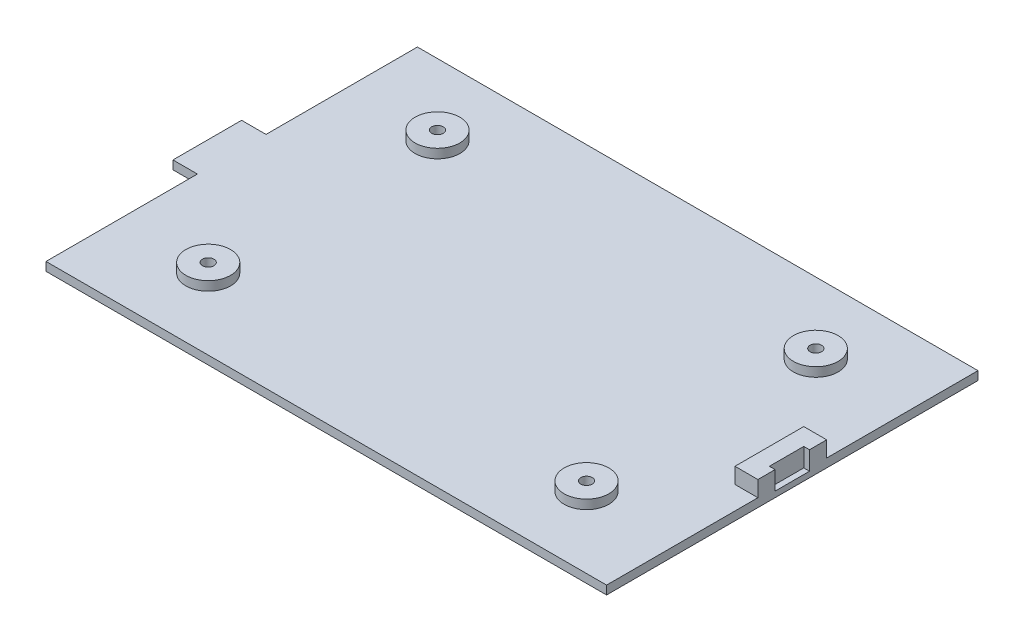
ISO-10303-21;
HEADER;
FILE_DESCRIPTION(('STEP AP214'),'2;1');
FILE_NAME('part.step','',(''),(''),'','','');
FILE_SCHEMA(('AUTOMOTIVE_DESIGN { 1 0 10303 214 1 1 1 1 }'));
ENDSEC;
DATA;
#1=APPLICATION_CONTEXT('core data for automotive mechanical design processes');
#2=APPLICATION_PROTOCOL_DEFINITION('international standard','automotive_design',2000,#1);
#3=PRODUCT_CONTEXT('',#1,'mechanical');
#4=PRODUCT('Part','Part','',(#3));
#5=PRODUCT_RELATED_PRODUCT_CATEGORY('part','',(#4));
#6=PRODUCT_DEFINITION_FORMATION('','',#4);
#7=PRODUCT_DEFINITION_CONTEXT('part definition',#1,'design');
#8=PRODUCT_DEFINITION('design','',#6,#7);
#9=PRODUCT_DEFINITION_SHAPE('','',#8);
#10=(LENGTH_UNIT() NAMED_UNIT(*) SI_UNIT(.MILLI.,.METRE.));
#11=(NAMED_UNIT(*) PLANE_ANGLE_UNIT() SI_UNIT($,.RADIAN.));
#12=(NAMED_UNIT(*) SI_UNIT($,.STERADIAN.) SOLID_ANGLE_UNIT());
#13=UNCERTAINTY_MEASURE_WITH_UNIT(LENGTH_MEASURE(1.E-05),#10,'distance_accuracy_value','');
#14=(GEOMETRIC_REPRESENTATION_CONTEXT(3) GLOBAL_UNCERTAINTY_ASSIGNED_CONTEXT((#13)) GLOBAL_UNIT_ASSIGNED_CONTEXT((#10,
#11,#12)) REPRESENTATION_CONTEXT('',''));
#15=CARTESIAN_POINT('',(0.,0.,0.));
#16=DIRECTION('',(0.,0.,1.));
#17=DIRECTION('',(1.,0.,0.));
#18=AXIS2_PLACEMENT_3D('',#15,#16,#17);
#19=CARTESIAN_POINT('',(0.,1.5,0.));
#20=DIRECTION('',(0.,1.,0.));
#21=DIRECTION('',(0.,0.,1.));
#22=AXIS2_PLACEMENT_3D('',#19,#20,#21);
#23=PLANE('',#22);
#24=CARTESIAN_POINT('',(-35.8144017117071,1.5,-3.9517301660766));
#25=DIRECTION('',(0.,1.,0.));
#26=DIRECTION('',(0.,0.,1.));
#27=AXIS2_PLACEMENT_3D('',#24,#25,#26);
#28=CIRCLE('',#27,3.9);
#29=CARTESIAN_POINT('',(-35.8144017117071,1.5,-0.0517301660765994));
#30=VERTEX_POINT('',#29);
#31=EDGE_CURVE('E182',#30,#30,#28,.T.);
#32=ORIENTED_EDGE('',*,*,#31,.F.);
#33=EDGE_LOOP('',(#32));
#34=FACE_BOUND('',#33,.T.);
#35=CARTESIAN_POINT('',(30.1855982882929,1.5,36.0482698339233));
#36=DIRECTION('',(0.,1.,0.));
#37=DIRECTION('',(0.,0.,1.));
#38=AXIS2_PLACEMENT_3D('',#35,#36,#37);
#39=CIRCLE('',#38,3.9);
#40=CARTESIAN_POINT('',(30.1855982882929,1.5,39.9482698339233));
#41=VERTEX_POINT('',#40);
#42=EDGE_CURVE('E194',#41,#41,#39,.T.);
#43=ORIENTED_EDGE('',*,*,#42,.F.);
#44=EDGE_LOOP('',(#43));
#45=FACE_BOUND('',#44,.T.);
#46=CARTESIAN_POINT('',(30.1855982882929,1.5,-3.95173016607654));
#47=DIRECTION('',(0.,1.,0.));
#48=DIRECTION('',(0.,0.,1.));
#49=AXIS2_PLACEMENT_3D('',#46,#47,#48);
#50=CIRCLE('',#49,3.9);
#51=CARTESIAN_POINT('',(30.1855982882929,1.5,-0.0517301660765438));
#52=VERTEX_POINT('',#51);
#53=EDGE_CURVE('E206',#52,#52,#50,.T.);
#54=ORIENTED_EDGE('',*,*,#53,.F.);
#55=EDGE_LOOP('',(#54));
#56=FACE_BOUND('',#55,.T.);
#57=CARTESIAN_POINT('',(-35.8144017117071,1.5,36.0482698339234));
#58=DIRECTION('',(0.,1.,0.));
#59=DIRECTION('',(0.,0.,1.));
#60=AXIS2_PLACEMENT_3D('',#57,#58,#59);
#61=CIRCLE('',#60,3.9);
#62=CARTESIAN_POINT('',(-35.8144017117071,1.5,39.9482698339234));
#63=VERTEX_POINT('',#62);
#64=EDGE_CURVE('E218',#63,#63,#61,.T.);
#65=ORIENTED_EDGE('',*,*,#64,.F.);
#66=EDGE_LOOP('',(#65));
#67=FACE_BOUND('',#66,.T.);
#68=DIRECTION('',(1.,0.,0.));
#69=VECTOR('',#68,1.);
#70=CARTESIAN_POINT('',(0.,1.5,22.0482698338859));
#71=LINE('',#70,#69);
#72=CARTESIAN_POINT('',(42.085598288953,1.5,22.0482698338859));
#73=VERTEX_POINT('',#72);
#74=CARTESIAN_POINT('',(46.0855982889815,1.5,22.0482698338859));
#75=VERTEX_POINT('',#74);
#76=EDGE_CURVE('E50',#73,#75,#71,.T.);
#77=ORIENTED_EDGE('',*,*,#76,.F.);
#78=DIRECTION('',(0.,0.,1.));
#79=VECTOR('',#78,1.);
#80=CARTESIAN_POINT('',(42.085598288953,1.5,0.));
#81=LINE('',#80,#79);
#82=CARTESIAN_POINT('',(42.085598288953,1.5,10.0482698339609));
#83=VERTEX_POINT('',#82);
#84=EDGE_CURVE('E55',#83,#73,#81,.T.);
#85=ORIENTED_EDGE('',*,*,#84,.F.);
#86=DIRECTION('',(-1.,0.,0.));
#87=VECTOR('',#86,1.);
#88=CARTESIAN_POINT('',(0.,1.5,10.0482698339609));
#89=LINE('',#88,#87);
#90=CARTESIAN_POINT('',(46.0855982889815,1.5,10.0482698339609));
#91=VERTEX_POINT('',#90);
#92=EDGE_CURVE('E249',#91,#83,#89,.T.);
#93=ORIENTED_EDGE('',*,*,#92,.F.);
#94=DIRECTION('',(0.,0.,-1.));
#95=VECTOR('',#94,1.);
#96=CARTESIAN_POINT('',(46.0855982889815,1.5,-16.3517301660766));
#97=LINE('',#96,#95);
#98=CARTESIAN_POINT('',(46.0855982889815,1.5,-16.3517301660766));
#99=VERTEX_POINT('',#98);
#100=EDGE_CURVE('E317',#91,#99,#97,.T.);
#101=ORIENTED_EDGE('',*,*,#100,.T.);
#102=DIRECTION('',(-1.,0.,0.));
#103=VECTOR('',#102,1.);
#104=CARTESIAN_POINT('',(-51.7144017110185,1.5,-16.3517301660766));
#105=LINE('',#104,#103);
#106=CARTESIAN_POINT('',(-51.7144017110185,1.5,-16.3517301660766));
#107=VERTEX_POINT('',#106);
#108=EDGE_CURVE('E316',#99,#107,#105,.T.);
#109=ORIENTED_EDGE('',*,*,#108,.T.);
#110=DIRECTION('',(0.,0.,1.));
#111=VECTOR('',#110,1.);
#112=CARTESIAN_POINT('',(-51.7144017110185,1.5,-16.3517301660766));
#113=LINE('',#112,#111);
#114=CARTESIAN_POINT('',(-51.7144017110185,1.5,10.0609698594753));
#115=VERTEX_POINT('',#114);
#116=EDGE_CURVE('E319',#107,#115,#113,.T.);
#117=ORIENTED_EDGE('',*,*,#116,.T.);
#118=DIRECTION('',(-1.,0.,0.));
#119=VECTOR('',#118,1.);
#120=CARTESIAN_POINT('',(-51.7144017110185,1.5,10.0609698594753));
#121=LINE('',#120,#119);
#122=CARTESIAN_POINT('',(-55.9767207738505,1.5,10.0609698594753));
#123=VERTEX_POINT('',#122);
#124=EDGE_CURVE('E321',#115,#123,#121,.T.);
#125=ORIENTED_EDGE('',*,*,#124,.T.);
#126=DIRECTION('',(0.,0.,1.));
#127=VECTOR('',#126,1.);
#128=CARTESIAN_POINT('',(-55.9767207738505,1.5,10.0609698594753));
#129=LINE('',#128,#127);
#130=CARTESIAN_POINT('',(-55.9767207738505,1.5,22.0355698086547));
#131=VERTEX_POINT('',#130);
#132=EDGE_CURVE('E323',#123,#131,#129,.T.);
#133=ORIENTED_EDGE('',*,*,#132,.T.);
#134=DIRECTION('',(1.,0.,0.));
#135=VECTOR('',#134,1.);
#136=CARTESIAN_POINT('',(-55.9767207738505,1.5,22.0355698086547));
#137=LINE('',#136,#135);
#138=CARTESIAN_POINT('',(-51.7144017110185,1.5,22.0355698086547));
#139=VERTEX_POINT('',#138);
#140=EDGE_CURVE('E325',#131,#139,#137,.T.);
#141=ORIENTED_EDGE('',*,*,#140,.T.);
#142=DIRECTION('',(0.,0.,1.));
#143=VECTOR('',#142,1.);
#144=CARTESIAN_POINT('',(-51.7144017110185,1.5,22.0355698086547));
#145=LINE('',#144,#143);
#146=CARTESIAN_POINT('',(-51.7144017110185,1.5,48.4482698339234));
#147=VERTEX_POINT('',#146);
#148=EDGE_CURVE('E327',#139,#147,#145,.T.);
#149=ORIENTED_EDGE('',*,*,#148,.T.);
#150=DIRECTION('',(1.,0.,0.));
#151=VECTOR('',#150,1.);
#152=CARTESIAN_POINT('',(-51.7144017110185,1.5,48.4482698339234));
#153=LINE('',#152,#151);
#154=CARTESIAN_POINT('',(46.0855982889815,1.5,48.4482698339234));
#155=VERTEX_POINT('',#154);
#156=EDGE_CURVE('E329',#147,#155,#153,.T.);
#157=ORIENTED_EDGE('',*,*,#156,.T.);
#158=EDGE_CURVE('E314',#155,#75,#97,.T.);
#159=ORIENTED_EDGE('',*,*,#158,.T.);
#160=EDGE_LOOP('',(#77,#85,#93,#101,#109,#117,#125,#133,#141,#149,#157,#159));
#161=FACE_BOUND('',#160,.T.);
#162=ADVANCED_FACE('F35',(#34,#45,#56,#67,#161),#23,.T.);
#163=CARTESIAN_POINT('',(46.0855982889815,1.5,-16.3517301660766));
#164=DIRECTION('',(-1.,0.,0.));
#165=DIRECTION('',(0.,0.,1.));
#166=AXIS2_PLACEMENT_3D('',#163,#164,#165);
#167=PLANE('',#166);
#168=DIRECTION('',(0.,0.,-1.));
#169=VECTOR('',#168,1.);
#170=CARTESIAN_POINT('',(46.0855982889815,1.,0.));
#171=LINE('',#170,#169);
#172=CARTESIAN_POINT('',(46.0855982889815,1.,19.0482698338859));
#173=VERTEX_POINT('',#172);
#174=CARTESIAN_POINT('',(46.0855982889815,1.,13.0482698338859));
#175=VERTEX_POINT('',#174);
#176=EDGE_CURVE('E152',#173,#175,#171,.T.);
#177=ORIENTED_EDGE('',*,*,#176,.F.);
#178=DIRECTION('',(0.,-1.,0.));
#179=VECTOR('',#178,1.);
#180=CARTESIAN_POINT('',(46.0855982889815,16.8991106406114,19.0482698338859));
#181=LINE('',#180,#179);
#182=CARTESIAN_POINT('',(46.0855982889815,4.25,19.0482698338859));
#183=VERTEX_POINT('',#182);
#184=EDGE_CURVE('E276',#183,#173,#181,.T.);
#185=ORIENTED_EDGE('',*,*,#184,.F.);
#186=DIRECTION('',(0.,0.,1.));
#187=VECTOR('',#186,1.);
#188=CARTESIAN_POINT('',(46.0855982889815,4.25,0.));
#189=LINE('',#188,#187);
#190=CARTESIAN_POINT('',(46.0855982889815,4.25,22.0482698338859));
#191=VERTEX_POINT('',#190);
#192=EDGE_CURVE('E250',#183,#191,#189,.T.);
#193=ORIENTED_EDGE('',*,*,#192,.T.);
#194=DIRECTION('',(0.,-1.,0.));
#195=VECTOR('',#194,1.);
#196=CARTESIAN_POINT('',(46.0855982889815,16.8991106406114,22.0482698338859));
#197=LINE('',#196,#195);
#198=EDGE_CURVE('E278',#191,#75,#197,.T.);
#199=ORIENTED_EDGE('',*,*,#198,.T.);
#200=ORIENTED_EDGE('',*,*,#158,.F.);
#201=DIRECTION('',(0.,-1.,0.));
#202=VECTOR('',#201,1.);
#203=CARTESIAN_POINT('',(46.0855982889815,1.5,48.4482698339234));
#204=LINE('',#203,#202);
#205=CARTESIAN_POINT('',(46.0855982889815,0.,48.4482698339234));
#206=VERTEX_POINT('',#205);
#207=EDGE_CURVE('E331',#155,#206,#204,.T.);
#208=ORIENTED_EDGE('',*,*,#207,.T.);
#209=DIRECTION('',(0.,0.,-1.));
#210=VECTOR('',#209,1.);
#211=CARTESIAN_POINT('',(46.0855982889815,0.,-16.3517301660766));
#212=LINE('',#211,#210);
#213=CARTESIAN_POINT('',(46.0855982889815,0.,-16.3517301660766));
#214=VERTEX_POINT('',#213);
#215=EDGE_CURVE('E311',#206,#214,#212,.T.);
#216=ORIENTED_EDGE('',*,*,#215,.T.);
#217=DIRECTION('',(0.,-1.,0.));
#218=VECTOR('',#217,1.);
#219=CARTESIAN_POINT('',(46.0855982889815,1.5,-16.3517301660766));
#220=LINE('',#219,#218);
#221=EDGE_CURVE('E11',#99,#214,#220,.T.);
#222=ORIENTED_EDGE('',*,*,#221,.F.);
#223=ORIENTED_EDGE('',*,*,#100,.F.);
#224=DIRECTION('',(0.,-1.,0.));
#225=VECTOR('',#224,1.);
#226=CARTESIAN_POINT('',(46.0855982889815,16.8991106406114,10.0482698339609));
#227=LINE('',#226,#225);
#228=CARTESIAN_POINT('',(46.0855982889815,4.25,10.0482698339609));
#229=VERTEX_POINT('',#228);
#230=EDGE_CURVE('E158',#229,#91,#227,.T.);
#231=ORIENTED_EDGE('',*,*,#230,.F.);
#232=DIRECTION('',(0.,0.,1.));
#233=VECTOR('',#232,1.);
#234=CARTESIAN_POINT('',(46.0855982889815,4.25,0.));
#235=LINE('',#234,#233);
#236=CARTESIAN_POINT('',(46.0855982889815,4.25,13.0482698339609));
#237=VERTEX_POINT('',#236);
#238=EDGE_CURVE('E154',#229,#237,#235,.T.);
#239=ORIENTED_EDGE('',*,*,#238,.T.);
#240=DIRECTION('',(0.,-1.,0.));
#241=VECTOR('',#240,1.);
#242=CARTESIAN_POINT('',(46.0855982889815,16.8991106406114,13.0482698339609));
#243=LINE('',#242,#241);
#244=EDGE_CURVE('E148',#237,#175,#243,.T.);
#245=ORIENTED_EDGE('',*,*,#244,.T.);
#246=EDGE_LOOP('',(#177,#185,#193,#199,#200,#208,#216,#222,#223,#231,#239,#245));
#247=FACE_BOUND('',#246,.T.);
#248=ADVANCED_FACE('F37',(#247),#167,.F.);
#249=CARTESIAN_POINT('',(-51.7144017110185,1.5,-16.3517301660766));
#250=DIRECTION('',(0.,0.,1.));
#251=DIRECTION('',(1.,0.,0.));
#252=AXIS2_PLACEMENT_3D('',#249,#250,#251);
#253=PLANE('',#252);
#254=DIRECTION('',(-1.,0.,0.));
#255=VECTOR('',#254,1.);
#256=CARTESIAN_POINT('',(-51.7144017110185,0.,-16.3517301660766));
#257=LINE('',#256,#255);
#258=CARTESIAN_POINT('',(-51.7144017110185,0.,-16.3517301660766));
#259=VERTEX_POINT('',#258);
#260=EDGE_CURVE('E334',#214,#259,#257,.T.);
#261=ORIENTED_EDGE('',*,*,#260,.T.);
#262=DIRECTION('',(0.,-1.,0.));
#263=VECTOR('',#262,1.);
#264=CARTESIAN_POINT('',(-51.7144017110185,1.5,-16.3517301660766));
#265=LINE('',#264,#263);
#266=EDGE_CURVE('E43',#107,#259,#265,.T.);
#267=ORIENTED_EDGE('',*,*,#266,.F.);
#268=ORIENTED_EDGE('',*,*,#108,.F.);
#269=ORIENTED_EDGE('',*,*,#221,.T.);
#270=EDGE_LOOP('',(#261,#267,#268,#269));
#271=FACE_BOUND('',#270,.T.);
#272=ADVANCED_FACE('F391',(#271),#253,.F.);
#273=CARTESIAN_POINT('',(-51.7144017110185,1.5,-16.3517301660766));
#274=DIRECTION('',(1.,0.,0.));
#275=DIRECTION('',(0.,0.,-1.));
#276=AXIS2_PLACEMENT_3D('',#273,#274,#275);
#277=PLANE('',#276);
#278=DIRECTION('',(0.,0.,1.));
#279=VECTOR('',#278,1.);
#280=CARTESIAN_POINT('',(-51.7144017110185,0.,-16.3517301660766));
#281=LINE('',#280,#279);
#282=CARTESIAN_POINT('',(-51.7144017110185,0.,10.0609698594753));
#283=VERTEX_POINT('',#282);
#284=EDGE_CURVE('E336',#259,#283,#281,.T.);
#285=ORIENTED_EDGE('',*,*,#284,.T.);
#286=DIRECTION('',(0.,-1.,0.));
#287=VECTOR('',#286,1.);
#288=CARTESIAN_POINT('',(-51.7144017110185,1.5,10.0609698594753));
#289=LINE('',#288,#287);
#290=EDGE_CURVE('E362',#115,#283,#289,.T.);
#291=ORIENTED_EDGE('',*,*,#290,.F.);
#292=ORIENTED_EDGE('',*,*,#116,.F.);
#293=ORIENTED_EDGE('',*,*,#266,.T.);
#294=EDGE_LOOP('',(#285,#291,#292,#293));
#295=FACE_BOUND('',#294,.T.);
#296=ADVANCED_FACE('F369',(#295),#277,.F.);
#297=CARTESIAN_POINT('',(-51.7144017110185,1.5,10.0609698594753));
#298=DIRECTION('',(0.,0.,1.));
#299=DIRECTION('',(1.,0.,0.));
#300=AXIS2_PLACEMENT_3D('',#297,#298,#299);
#301=PLANE('',#300);
#302=DIRECTION('',(-1.,0.,0.));
#303=VECTOR('',#302,1.);
#304=CARTESIAN_POINT('',(-51.7144017110185,0.,10.0609698594753));
#305=LINE('',#304,#303);
#306=CARTESIAN_POINT('',(-55.9767207738505,0.,10.0609698594753));
#307=VERTEX_POINT('',#306);
#308=EDGE_CURVE('E338',#283,#307,#305,.T.);
#309=ORIENTED_EDGE('',*,*,#308,.T.);
#310=DIRECTION('',(0.,-1.,0.));
#311=VECTOR('',#310,1.);
#312=CARTESIAN_POINT('',(-55.9767207738505,1.5,10.0609698594753));
#313=LINE('',#312,#311);
#314=EDGE_CURVE('E359',#123,#307,#313,.T.);
#315=ORIENTED_EDGE('',*,*,#314,.F.);
#316=ORIENTED_EDGE('',*,*,#124,.F.);
#317=ORIENTED_EDGE('',*,*,#290,.T.);
#318=EDGE_LOOP('',(#309,#315,#316,#317));
#319=FACE_BOUND('',#318,.T.);
#320=ADVANCED_FACE('F381',(#319),#301,.F.);
#321=CARTESIAN_POINT('',(-55.9767207738505,1.5,10.0609698594753));
#322=DIRECTION('',(1.,0.,0.));
#323=DIRECTION('',(0.,0.,-1.));
#324=AXIS2_PLACEMENT_3D('',#321,#322,#323);
#325=PLANE('',#324);
#326=DIRECTION('',(0.,0.,1.));
#327=VECTOR('',#326,1.);
#328=CARTESIAN_POINT('',(-55.9767207738505,0.,10.0609698594753));
#329=LINE('',#328,#327);
#330=CARTESIAN_POINT('',(-55.9767207738505,0.,22.0355698086547));
#331=VERTEX_POINT('',#330);
#332=EDGE_CURVE('E340',#307,#331,#329,.T.);
#333=ORIENTED_EDGE('',*,*,#332,.T.);
#334=DIRECTION('',(0.,-1.,0.));
#335=VECTOR('',#334,1.);
#336=CARTESIAN_POINT('',(-55.9767207738505,1.5,22.0355698086547));
#337=LINE('',#336,#335);
#338=EDGE_CURVE('E356',#131,#331,#337,.T.);
#339=ORIENTED_EDGE('',*,*,#338,.F.);
#340=ORIENTED_EDGE('',*,*,#132,.F.);
#341=ORIENTED_EDGE('',*,*,#314,.T.);
#342=EDGE_LOOP('',(#333,#339,#340,#341));
#343=FACE_BOUND('',#342,.T.);
#344=ADVANCED_FACE('F385',(#343),#325,.F.);
#345=CARTESIAN_POINT('',(-55.9767207738505,1.5,22.0355698086547));
#346=DIRECTION('',(0.,0.,-1.));
#347=DIRECTION('',(-1.,0.,0.));
#348=AXIS2_PLACEMENT_3D('',#345,#346,#347);
#349=PLANE('',#348);
#350=DIRECTION('',(1.,0.,0.));
#351=VECTOR('',#350,1.);
#352=CARTESIAN_POINT('',(-55.9767207738505,0.,22.0355698086547));
#353=LINE('',#352,#351);
#354=CARTESIAN_POINT('',(-51.7144017110185,0.,22.0355698086547));
#355=VERTEX_POINT('',#354);
#356=EDGE_CURVE('E342',#331,#355,#353,.T.);
#357=ORIENTED_EDGE('',*,*,#356,.T.);
#358=DIRECTION('',(0.,-1.,0.));
#359=VECTOR('',#358,1.);
#360=CARTESIAN_POINT('',(-51.7144017110185,1.5,22.0355698086547));
#361=LINE('',#360,#359);
#362=EDGE_CURVE('E353',#139,#355,#361,.T.);
#363=ORIENTED_EDGE('',*,*,#362,.F.);
#364=ORIENTED_EDGE('',*,*,#140,.F.);
#365=ORIENTED_EDGE('',*,*,#338,.T.);
#366=EDGE_LOOP('',(#357,#363,#364,#365));
#367=FACE_BOUND('',#366,.T.);
#368=ADVANCED_FACE('F404',(#367),#349,.F.);
#369=CARTESIAN_POINT('',(-51.7144017110185,1.5,22.0355698086547));
#370=DIRECTION('',(1.,0.,0.));
#371=DIRECTION('',(0.,0.,-1.));
#372=AXIS2_PLACEMENT_3D('',#369,#370,#371);
#373=PLANE('',#372);
#374=DIRECTION('',(0.,0.,1.));
#375=VECTOR('',#374,1.);
#376=CARTESIAN_POINT('',(-51.7144017110185,0.,22.0355698086547));
#377=LINE('',#376,#375);
#378=CARTESIAN_POINT('',(-51.7144017110185,0.,48.4482698339234));
#379=VERTEX_POINT('',#378);
#380=EDGE_CURVE('E344',#355,#379,#377,.T.);
#381=ORIENTED_EDGE('',*,*,#380,.T.);
#382=DIRECTION('',(0.,-1.,0.));
#383=VECTOR('',#382,1.);
#384=CARTESIAN_POINT('',(-51.7144017110185,1.5,48.4482698339234));
#385=LINE('',#384,#383);
#386=EDGE_CURVE('E350',#147,#379,#385,.T.);
#387=ORIENTED_EDGE('',*,*,#386,.F.);
#388=ORIENTED_EDGE('',*,*,#148,.F.);
#389=ORIENTED_EDGE('',*,*,#362,.T.);
#390=EDGE_LOOP('',(#381,#387,#388,#389));
#391=FACE_BOUND('',#390,.T.);
#392=ADVANCED_FACE('F402',(#391),#373,.F.);
#393=CARTESIAN_POINT('',(-51.7144017110185,1.5,48.4482698339234));
#394=DIRECTION('',(0.,0.,-1.));
#395=DIRECTION('',(-1.,0.,0.));
#396=AXIS2_PLACEMENT_3D('',#393,#394,#395);
#397=PLANE('',#396);
#398=DIRECTION('',(1.,0.,0.));
#399=VECTOR('',#398,1.);
#400=CARTESIAN_POINT('',(-51.7144017110185,0.,48.4482698339234));
#401=LINE('',#400,#399);
#402=EDGE_CURVE('E346',#379,#206,#401,.T.);
#403=ORIENTED_EDGE('',*,*,#402,.T.);
#404=ORIENTED_EDGE('',*,*,#207,.F.);
#405=ORIENTED_EDGE('',*,*,#156,.F.);
#406=ORIENTED_EDGE('',*,*,#386,.T.);
#407=EDGE_LOOP('',(#403,#404,#405,#406));
#408=FACE_BOUND('',#407,.T.);
#409=ADVANCED_FACE('F397',(#408),#397,.F.);
#410=CARTESIAN_POINT('',(0.,0.,0.));
#411=DIRECTION('',(0.,1.,0.));
#412=DIRECTION('',(0.,0.,1.));
#413=AXIS2_PLACEMENT_3D('',#410,#411,#412);
#414=PLANE('',#413);
#415=CARTESIAN_POINT('',(30.1855982882929,0.,36.0482698339234));
#416=DIRECTION('',(0.,-1.,0.));
#417=DIRECTION('',(0.,0.,-1.));
#418=AXIS2_PLACEMENT_3D('',#415,#416,#417);
#419=CIRCLE('',#418,5.00000000004173);
#420=CARTESIAN_POINT('',(30.1855982882929,0.,31.0482698338817));
#421=VERTEX_POINT('',#420);
#422=EDGE_CURVE('E269',#421,#421,#419,.T.);
#423=ORIENTED_EDGE('',*,*,#422,.F.);
#424=EDGE_LOOP('',(#423));
#425=FACE_BOUND('',#424,.T.);
#426=CARTESIAN_POINT('',(-35.8144017117071,0.,-3.95173016607658));
#427=DIRECTION('',(0.,-1.,0.));
#428=DIRECTION('',(0.,0.,-1.));
#429=AXIS2_PLACEMENT_3D('',#426,#427,#428);
#430=CIRCLE('',#429,5.);
#431=CARTESIAN_POINT('',(-35.8144017117071,0.,-8.95173016607658));
#432=VERTEX_POINT('',#431);
#433=EDGE_CURVE('E300',#432,#432,#430,.T.);
#434=ORIENTED_EDGE('',*,*,#433,.F.);
#435=EDGE_LOOP('',(#434));
#436=FACE_BOUND('',#435,.T.);
#437=CARTESIAN_POINT('',(30.1855982882929,0.,-3.95173016607664));
#438=DIRECTION('',(0.,-1.,0.));
#439=DIRECTION('',(0.,0.,1.));
#440=AXIS2_PLACEMENT_3D('',#437,#438,#439);
#441=CIRCLE('',#440,5.00000000004173);
#442=CARTESIAN_POINT('',(30.1855982882929,0.,1.0482698339651));
#443=VERTEX_POINT('',#442);
#444=EDGE_CURVE('E294',#443,#443,#441,.T.);
#445=ORIENTED_EDGE('',*,*,#444,.F.);
#446=EDGE_LOOP('',(#445));
#447=FACE_BOUND('',#446,.T.);
#448=CARTESIAN_POINT('',(-35.8144017117071,0.,36.0482698339234));
#449=DIRECTION('',(0.,-1.,0.));
#450=DIRECTION('',(0.,0.,-1.));
#451=AXIS2_PLACEMENT_3D('',#448,#449,#450);
#452=CIRCLE('',#451,5.);
#453=CARTESIAN_POINT('',(-35.8144017117071,0.,31.0482698339234));
#454=VERTEX_POINT('',#453);
#455=EDGE_CURVE('E293',#454,#454,#452,.T.);
#456=ORIENTED_EDGE('',*,*,#455,.F.);
#457=EDGE_LOOP('',(#456));
#458=FACE_BOUND('',#457,.T.);
#459=ORIENTED_EDGE('',*,*,#215,.F.);
#460=ORIENTED_EDGE('',*,*,#402,.F.);
#461=ORIENTED_EDGE('',*,*,#380,.F.);
#462=ORIENTED_EDGE('',*,*,#356,.F.);
#463=ORIENTED_EDGE('',*,*,#332,.F.);
#464=ORIENTED_EDGE('',*,*,#308,.F.);
#465=ORIENTED_EDGE('',*,*,#284,.F.);
#466=ORIENTED_EDGE('',*,*,#260,.F.);
#467=EDGE_LOOP('',(#459,#460,#461,#462,#463,#464,#465,#466));
#468=FACE_BOUND('',#467,.T.);
#469=ADVANCED_FACE('F376',(#425,#436,#447,#458,#468),#414,.F.);
#470=CARTESIAN_POINT('',(-35.8144017117071,0.5,36.0482698339234));
#471=DIRECTION('',(0.,-1.,0.));
#472=DIRECTION('',(0.,0.,-1.));
#473=AXIS2_PLACEMENT_3D('',#470,#471,#472);
#474=CYLINDRICAL_SURFACE('',#473,5.);
#475=CARTESIAN_POINT('',(-35.8144017117071,0.5,36.0482698339234));
#476=DIRECTION('',(0.,-1.,0.));
#477=DIRECTION('',(0.,0.,-1.));
#478=AXIS2_PLACEMENT_3D('',#475,#476,#477);
#479=CIRCLE('',#478,5.);
#480=CARTESIAN_POINT('',(-35.8144017117071,0.5,31.0482698339234));
#481=VERTEX_POINT('',#480);
#482=EDGE_CURVE('E308',#481,#481,#479,.T.);
#483=ORIENTED_EDGE('',*,*,#482,.F.);
#484=EDGE_LOOP('',(#483));
#485=FACE_BOUND('',#484,.T.);
#486=ORIENTED_EDGE('',*,*,#455,.T.);
#487=EDGE_LOOP('',(#486));
#488=FACE_BOUND('',#487,.T.);
#489=ADVANCED_FACE('F423',(#485,#488),#474,.F.);
#490=CARTESIAN_POINT('',(-35.8144017117071,0.5,36.0482698339234));
#491=DIRECTION('',(0.,-1.,0.));
#492=DIRECTION('',(0.,0.,-1.));
#493=AXIS2_PLACEMENT_3D('',#490,#491,#492);
#494=PLANE('',#493);
#495=CARTESIAN_POINT('',(-35.8144017117071,0.5,36.0482698339234));
#496=DIRECTION('',(0.,-1.,0.));
#497=DIRECTION('',(0.,0.,-1.));
#498=AXIS2_PLACEMENT_3D('',#495,#496,#497);
#499=CIRCLE('',#498,2.);
#500=CARTESIAN_POINT('',(-35.8144017117071,0.5,34.0482698339234));
#501=VERTEX_POINT('',#500);
#502=EDGE_CURVE('E229',#501,#501,#499,.F.);
#503=ORIENTED_EDGE('',*,*,#502,.T.);
#504=EDGE_LOOP('',(#503));
#505=FACE_BOUND('',#504,.T.);
#506=ORIENTED_EDGE('',*,*,#482,.T.);
#507=EDGE_LOOP('',(#506));
#508=FACE_BOUND('',#507,.T.);
#509=ADVANCED_FACE('F443',(#505,#508),#494,.T.);
#510=CARTESIAN_POINT('',(30.1855982882929,0.5,-3.95173016607664));
#511=DIRECTION('',(0.,-1.,0.));
#512=DIRECTION('',(0.,0.,-1.));
#513=AXIS2_PLACEMENT_3D('',#510,#511,#512);
#514=CYLINDRICAL_SURFACE('',#513,5.00000000004173);
#515=CARTESIAN_POINT('',(30.1855982882929,0.5,-3.95173016607664));
#516=DIRECTION('',(0.,-1.,0.));
#517=DIRECTION('',(0.,0.,1.));
#518=AXIS2_PLACEMENT_3D('',#515,#516,#517);
#519=CIRCLE('',#518,5.00000000004173);
#520=CARTESIAN_POINT('',(30.1855982882929,0.5,1.0482698339651));
#521=VERTEX_POINT('',#520);
#522=EDGE_CURVE('E290',#521,#521,#519,.T.);
#523=ORIENTED_EDGE('',*,*,#522,.F.);
#524=EDGE_LOOP('',(#523));
#525=FACE_BOUND('',#524,.T.);
#526=ORIENTED_EDGE('',*,*,#444,.T.);
#527=EDGE_LOOP('',(#526));
#528=FACE_BOUND('',#527,.T.);
#529=ADVANCED_FACE('F451',(#525,#528),#514,.F.);
#530=CARTESIAN_POINT('',(30.1855982882929,0.5,-3.95173016607664));
#531=DIRECTION('',(0.,1.,0.));
#532=DIRECTION('',(0.,0.,1.));
#533=AXIS2_PLACEMENT_3D('',#530,#531,#532);
#534=PLANE('',#533);
#535=CARTESIAN_POINT('',(30.1855982882929,0.5,-3.95173016607657));
#536=DIRECTION('',(0.,1.,0.));
#537=DIRECTION('',(0.,0.,1.));
#538=AXIS2_PLACEMENT_3D('',#535,#536,#537);
#539=CIRCLE('',#538,2.00000000000001);
#540=CARTESIAN_POINT('',(30.1855982882929,0.5,-1.95173016607656));
#541=VERTEX_POINT('',#540);
#542=EDGE_CURVE('E226',#541,#541,#539,.F.);
#543=ORIENTED_EDGE('',*,*,#542,.F.);
#544=EDGE_LOOP('',(#543));
#545=FACE_BOUND('',#544,.T.);
#546=ORIENTED_EDGE('',*,*,#522,.T.);
#547=EDGE_LOOP('',(#546));
#548=FACE_BOUND('',#547,.T.);
#549=ADVANCED_FACE('F459',(#545,#548),#534,.F.);
#550=CARTESIAN_POINT('',(-35.8144017117071,0.5,-3.95173016607658));
#551=DIRECTION('',(0.,-1.,0.));
#552=DIRECTION('',(0.,0.,-1.));
#553=AXIS2_PLACEMENT_3D('',#550,#551,#552);
#554=CYLINDRICAL_SURFACE('',#553,5.);
#555=CARTESIAN_POINT('',(-35.8144017117071,0.5,-3.95173016607658));
#556=DIRECTION('',(0.,-1.,0.));
#557=DIRECTION('',(0.,0.,-1.));
#558=AXIS2_PLACEMENT_3D('',#555,#556,#557);
#559=CIRCLE('',#558,5.);
#560=CARTESIAN_POINT('',(-35.8144017117071,0.5,-8.95173016607658));
#561=VERTEX_POINT('',#560);
#562=EDGE_CURVE('E297',#561,#561,#559,.T.);
#563=ORIENTED_EDGE('',*,*,#562,.F.);
#564=EDGE_LOOP('',(#563));
#565=FACE_BOUND('',#564,.T.);
#566=ORIENTED_EDGE('',*,*,#433,.T.);
#567=EDGE_LOOP('',(#566));
#568=FACE_BOUND('',#567,.T.);
#569=ADVANCED_FACE('F467',(#565,#568),#554,.F.);
#570=CARTESIAN_POINT('',(-35.8144017117071,0.5,-3.95173016607658));
#571=DIRECTION('',(0.,-1.,0.));
#572=DIRECTION('',(0.,0.,-1.));
#573=AXIS2_PLACEMENT_3D('',#570,#571,#572);
#574=PLANE('',#573);
#575=CARTESIAN_POINT('',(-35.8144017117071,0.5,-3.95173016607665));
#576=DIRECTION('',(0.,-1.,0.));
#577=DIRECTION('',(0.,0.,-1.));
#578=AXIS2_PLACEMENT_3D('',#575,#576,#577);
#579=CIRCLE('',#578,2.);
#580=CARTESIAN_POINT('',(-35.8144017117071,0.5,-5.95173016607665));
#581=VERTEX_POINT('',#580);
#582=EDGE_CURVE('E217',#581,#581,#579,.F.);
#583=ORIENTED_EDGE('',*,*,#582,.T.);
#584=EDGE_LOOP('',(#583));
#585=FACE_BOUND('',#584,.T.);
#586=ORIENTED_EDGE('',*,*,#562,.T.);
#587=EDGE_LOOP('',(#586));
#588=FACE_BOUND('',#587,.T.);
#589=ADVANCED_FACE('F475',(#585,#588),#574,.T.);
#590=CARTESIAN_POINT('',(30.1855982882929,0.5,36.0482698339234));
#591=DIRECTION('',(0.,-1.,0.));
#592=DIRECTION('',(0.,0.,-1.));
#593=AXIS2_PLACEMENT_3D('',#590,#591,#592);
#594=CYLINDRICAL_SURFACE('',#593,5.00000000004173);
#595=CARTESIAN_POINT('',(30.1855982882929,0.5,36.0482698339234));
#596=DIRECTION('',(0.,-1.,0.));
#597=DIRECTION('',(0.,0.,-1.));
#598=AXIS2_PLACEMENT_3D('',#595,#596,#597);
#599=CIRCLE('',#598,5.00000000004173);
#600=CARTESIAN_POINT('',(30.1855982882929,0.5,31.0482698338817));
#601=VERTEX_POINT('',#600);
#602=EDGE_CURVE('E303',#601,#601,#599,.T.);
#603=ORIENTED_EDGE('',*,*,#602,.F.);
#604=EDGE_LOOP('',(#603));
#605=FACE_BOUND('',#604,.T.);
#606=ORIENTED_EDGE('',*,*,#422,.T.);
#607=EDGE_LOOP('',(#606));
#608=FACE_BOUND('',#607,.T.);
#609=ADVANCED_FACE('F483',(#605,#608),#594,.F.);
#610=CARTESIAN_POINT('',(30.1855982882929,0.5,36.0482698339234));
#611=DIRECTION('',(0.,-1.,0.));
#612=DIRECTION('',(0.,0.,-1.));
#613=AXIS2_PLACEMENT_3D('',#610,#611,#612);
#614=PLANE('',#613);
#615=CARTESIAN_POINT('',(30.1855982882929,0.5,36.0482698339233));
#616=DIRECTION('',(0.,-1.,0.));
#617=DIRECTION('',(0.,0.,-1.));
#618=AXIS2_PLACEMENT_3D('',#615,#616,#617);
#619=CIRCLE('',#618,2.);
#620=CARTESIAN_POINT('',(30.1855982882929,0.5,34.0482698339233));
#621=VERTEX_POINT('',#620);
#622=EDGE_CURVE('E234',#621,#621,#619,.F.);
#623=ORIENTED_EDGE('',*,*,#622,.T.);
#624=EDGE_LOOP('',(#623));
#625=FACE_BOUND('',#624,.T.);
#626=ORIENTED_EDGE('',*,*,#602,.T.);
#627=EDGE_LOOP('',(#626));
#628=FACE_BOUND('',#627,.T.);
#629=ADVANCED_FACE('F491',(#625,#628),#614,.T.);
#630=CARTESIAN_POINT('',(0.,16.8991106406114,19.0482698338858));
#631=DIRECTION('',(0.,0.,1.));
#632=DIRECTION('',(1.,0.,0.));
#633=AXIS2_PLACEMENT_3D('',#630,#631,#632);
#634=PLANE('',#633);
#635=DIRECTION('',(0.,-1.,0.));
#636=VECTOR('',#635,1.);
#637=CARTESIAN_POINT('',(45.085598288953,16.8991106406114,19.0482698338859));
#638=LINE('',#637,#636);
#639=CARTESIAN_POINT('',(45.085598288953,4.25,19.0482698338859));
#640=VERTEX_POINT('',#639);
#641=CARTESIAN_POINT('',(45.085598288953,1.,19.0482698338859));
#642=VERTEX_POINT('',#641);
#643=EDGE_CURVE('E274',#640,#642,#638,.T.);
#644=ORIENTED_EDGE('',*,*,#643,.F.);
#645=DIRECTION('',(1.,0.,0.));
#646=VECTOR('',#645,1.);
#647=CARTESIAN_POINT('',(0.,4.25,19.0482698338858));
#648=LINE('',#647,#646);
#649=EDGE_CURVE('E254',#640,#183,#648,.T.);
#650=ORIENTED_EDGE('',*,*,#649,.T.);
#651=ORIENTED_EDGE('',*,*,#184,.T.);
#652=DIRECTION('',(1.,0.,0.));
#653=VECTOR('',#652,1.);
#654=CARTESIAN_POINT('',(0.,1.,19.0482698338859));
#655=LINE('',#654,#653);
#656=EDGE_CURVE('E172',#642,#173,#655,.T.);
#657=ORIENTED_EDGE('',*,*,#656,.F.);
#658=EDGE_LOOP('',(#644,#650,#651,#657));
#659=FACE_BOUND('',#658,.T.);
#660=ADVANCED_FACE('F499',(#659),#634,.F.);
#661=CARTESIAN_POINT('',(0.,16.8991106406114,22.0482698338859));
#662=DIRECTION('',(0.,0.,-1.));
#663=DIRECTION('',(-1.,0.,0.));
#664=AXIS2_PLACEMENT_3D('',#661,#662,#663);
#665=PLANE('',#664);
#666=ORIENTED_EDGE('',*,*,#198,.F.);
#667=DIRECTION('',(-1.,0.,0.));
#668=VECTOR('',#667,1.);
#669=CARTESIAN_POINT('',(0.,4.25,22.0482698338859));
#670=LINE('',#669,#668);
#671=CARTESIAN_POINT('',(42.085598288953,4.25,22.0482698338859));
#672=VERTEX_POINT('',#671);
#673=EDGE_CURVE('E253',#191,#672,#670,.T.);
#674=ORIENTED_EDGE('',*,*,#673,.T.);
#675=DIRECTION('',(0.,-1.,0.));
#676=VECTOR('',#675,1.);
#677=CARTESIAN_POINT('',(42.085598288953,16.8991106406114,22.0482698338859));
#678=LINE('',#677,#676);
#679=EDGE_CURVE('E281',#672,#73,#678,.T.);
#680=ORIENTED_EDGE('',*,*,#679,.T.);
#681=ORIENTED_EDGE('',*,*,#76,.T.);
#682=EDGE_LOOP('',(#666,#674,#680,#681));
#683=FACE_BOUND('',#682,.T.);
#684=ADVANCED_FACE('F508',(#683),#665,.F.);
#685=CARTESIAN_POINT('',(42.085598288953,16.8991106406114,0.));
#686=DIRECTION('',(1.,0.,0.));
#687=DIRECTION('',(0.,0.,-1.));
#688=AXIS2_PLACEMENT_3D('',#685,#686,#687);
#689=PLANE('',#688);
#690=ORIENTED_EDGE('',*,*,#679,.F.);
#691=DIRECTION('',(0.,0.,-1.));
#692=VECTOR('',#691,1.);
#693=CARTESIAN_POINT('',(42.085598288953,4.25,0.));
#694=LINE('',#693,#692);
#695=CARTESIAN_POINT('',(42.085598288953,4.25,10.0482698339609));
#696=VERTEX_POINT('',#695);
#697=EDGE_CURVE('E257',#672,#696,#694,.T.);
#698=ORIENTED_EDGE('',*,*,#697,.T.);
#699=DIRECTION('',(0.,-1.,0.));
#700=VECTOR('',#699,1.);
#701=CARTESIAN_POINT('',(42.085598288953,16.8991106406114,10.0482698339609));
#702=LINE('',#701,#700);
#703=EDGE_CURVE('E283',#696,#83,#702,.T.);
#704=ORIENTED_EDGE('',*,*,#703,.T.);
#705=ORIENTED_EDGE('',*,*,#84,.T.);
#706=EDGE_LOOP('',(#690,#698,#704,#705));
#707=FACE_BOUND('',#706,.T.);
#708=ADVANCED_FACE('F517',(#707),#689,.F.);
#709=CARTESIAN_POINT('',(0.,16.8991106406114,10.0482698339609));
#710=DIRECTION('',(0.,0.,1.));
#711=DIRECTION('',(1.,0.,0.));
#712=AXIS2_PLACEMENT_3D('',#709,#710,#711);
#713=PLANE('',#712);
#714=ORIENTED_EDGE('',*,*,#703,.F.);
#715=DIRECTION('',(1.,0.,0.));
#716=VECTOR('',#715,1.);
#717=CARTESIAN_POINT('',(0.,4.25,10.0482698339609));
#718=LINE('',#717,#716);
#719=EDGE_CURVE('E260',#696,#229,#718,.T.);
#720=ORIENTED_EDGE('',*,*,#719,.T.);
#721=ORIENTED_EDGE('',*,*,#230,.T.);
#722=ORIENTED_EDGE('',*,*,#92,.T.);
#723=EDGE_LOOP('',(#714,#720,#721,#722));
#724=FACE_BOUND('',#723,.T.);
#725=ADVANCED_FACE('F525',(#724),#713,.F.);
#726=CARTESIAN_POINT('',(0.,16.8991106406114,13.048269833961));
#727=DIRECTION('',(0.,0.,-1.));
#728=DIRECTION('',(-1.,0.,0.));
#729=AXIS2_PLACEMENT_3D('',#726,#727,#728);
#730=PLANE('',#729);
#731=ORIENTED_EDGE('',*,*,#244,.F.);
#732=DIRECTION('',(-1.,0.,0.));
#733=VECTOR('',#732,1.);
#734=CARTESIAN_POINT('',(0.,4.25,13.048269833961));
#735=LINE('',#734,#733);
#736=CARTESIAN_POINT('',(45.085598288953,4.25,13.0482698339609));
#737=VERTEX_POINT('',#736);
#738=EDGE_CURVE('E264',#237,#737,#735,.T.);
#739=ORIENTED_EDGE('',*,*,#738,.T.);
#740=DIRECTION('',(0.,-1.,0.));
#741=VECTOR('',#740,1.);
#742=CARTESIAN_POINT('',(45.085598288953,16.8991106406114,13.0482698339609));
#743=LINE('',#742,#741);
#744=CARTESIAN_POINT('',(45.085598288953,1.,13.0482698338859));
#745=VERTEX_POINT('',#744);
#746=EDGE_CURVE('E157',#737,#745,#743,.T.);
#747=ORIENTED_EDGE('',*,*,#746,.T.);
#748=DIRECTION('',(-1.,0.,0.));
#749=VECTOR('',#748,1.);
#750=CARTESIAN_POINT('',(0.,1.,13.0482698338859));
#751=LINE('',#750,#749);
#752=EDGE_CURVE('E161',#175,#745,#751,.T.);
#753=ORIENTED_EDGE('',*,*,#752,.F.);
#754=EDGE_LOOP('',(#731,#739,#747,#753));
#755=FACE_BOUND('',#754,.T.);
#756=ADVANCED_FACE('F162',(#755),#730,.F.);
#757=CARTESIAN_POINT('',(45.085598288953,16.8991106406114,0.));
#758=DIRECTION('',(-1.,0.,0.));
#759=DIRECTION('',(0.,0.,1.));
#760=AXIS2_PLACEMENT_3D('',#757,#758,#759);
#761=PLANE('',#760);
#762=ORIENTED_EDGE('',*,*,#746,.F.);
#763=DIRECTION('',(0.,0.,1.));
#764=VECTOR('',#763,1.);
#765=CARTESIAN_POINT('',(45.085598288953,4.25,0.));
#766=LINE('',#765,#764);
#767=EDGE_CURVE('E266',#737,#640,#766,.T.);
#768=ORIENTED_EDGE('',*,*,#767,.T.);
#769=ORIENTED_EDGE('',*,*,#643,.T.);
#770=DIRECTION('',(0.,0.,1.));
#771=VECTOR('',#770,1.);
#772=CARTESIAN_POINT('',(45.085598288953,1.,0.));
#773=LINE('',#772,#771);
#774=EDGE_CURVE('E167',#745,#642,#773,.T.);
#775=ORIENTED_EDGE('',*,*,#774,.F.);
#776=EDGE_LOOP('',(#762,#768,#769,#775));
#777=FACE_BOUND('',#776,.T.);
#778=ADVANCED_FACE('F539',(#777),#761,.F.);
#779=CARTESIAN_POINT('',(45.1855982889531,4.25,17.0682698338859));
#780=DIRECTION('',(0.,-1.,0.));
#781=DIRECTION('',(0.,0.,-1.));
#782=AXIS2_PLACEMENT_3D('',#779,#780,#781);
#783=PLANE('',#782);
#784=ORIENTED_EDGE('',*,*,#738,.F.);
#785=ORIENTED_EDGE('',*,*,#238,.F.);
#786=ORIENTED_EDGE('',*,*,#719,.F.);
#787=ORIENTED_EDGE('',*,*,#697,.F.);
#788=ORIENTED_EDGE('',*,*,#673,.F.);
#789=ORIENTED_EDGE('',*,*,#192,.F.);
#790=ORIENTED_EDGE('',*,*,#649,.F.);
#791=ORIENTED_EDGE('',*,*,#767,.F.);
#792=EDGE_LOOP('',(#784,#785,#786,#787,#788,#789,#790,#791));
#793=FACE_BOUND('',#792,.T.);
#794=ADVANCED_FACE('F546',(#793),#783,.F.);
#795=CARTESIAN_POINT('',(-35.8144017117071,4.251,36.0482698339234));
#796=DIRECTION('',(0.,-1.,0.));
#797=DIRECTION('',(0.,0.,-1.));
#798=AXIS2_PLACEMENT_3D('',#795,#796,#797);
#799=CYLINDRICAL_SURFACE('',#798,2.);
#800=CARTESIAN_POINT('',(-35.8144017117071,1.5,36.0482698339234));
#801=DIRECTION('',(0.,1.,0.));
#802=DIRECTION('',(0.,0.,1.));
#803=AXIS2_PLACEMENT_3D('',#800,#801,#802);
#804=CIRCLE('',#803,2.);
#805=CARTESIAN_POINT('',(-35.8144017117071,1.5,38.0482698339234));
#806=VERTEX_POINT('',#805);
#807=EDGE_CURVE('E246',#806,#806,#804,.F.);
#808=ORIENTED_EDGE('',*,*,#807,.F.);
#809=EDGE_LOOP('',(#808));
#810=FACE_BOUND('',#809,.T.);
#811=ORIENTED_EDGE('',*,*,#502,.F.);
#812=EDGE_LOOP('',(#811));
#813=FACE_BOUND('',#812,.T.);
#814=ADVANCED_FACE('F554',(#810,#813),#799,.F.);
#815=CARTESIAN_POINT('',(30.1855982882929,4.251,-3.95173016607657));
#816=DIRECTION('',(0.,-1.,0.));
#817=DIRECTION('',(0.,0.,-1.));
#818=AXIS2_PLACEMENT_3D('',#815,#816,#817);
#819=CYLINDRICAL_SURFACE('',#818,2.00000000000001);
#820=CARTESIAN_POINT('',(30.1855982882929,1.5,-3.95173016607657));
#821=DIRECTION('',(0.,1.,0.));
#822=DIRECTION('',(0.,0.,1.));
#823=AXIS2_PLACEMENT_3D('',#820,#821,#822);
#824=CIRCLE('',#823,2.00000000000001);
#825=CARTESIAN_POINT('',(30.1855982882929,1.5,-1.95173016607656));
#826=VERTEX_POINT('',#825);
#827=EDGE_CURVE('E230',#826,#826,#824,.F.);
#828=ORIENTED_EDGE('',*,*,#827,.F.);
#829=EDGE_LOOP('',(#828));
#830=FACE_BOUND('',#829,.T.);
#831=ORIENTED_EDGE('',*,*,#542,.T.);
#832=EDGE_LOOP('',(#831));
#833=FACE_BOUND('',#832,.T.);
#834=ADVANCED_FACE('F561',(#830,#833),#819,.F.);
#835=CARTESIAN_POINT('',(30.1855982882929,4.251,36.0482698339233));
#836=DIRECTION('',(0.,-1.,0.));
#837=DIRECTION('',(0.,0.,-1.));
#838=AXIS2_PLACEMENT_3D('',#835,#836,#837);
#839=CYLINDRICAL_SURFACE('',#838,2.);
#840=CARTESIAN_POINT('',(30.1855982882929,1.5,36.0482698339233));
#841=DIRECTION('',(0.,1.,0.));
#842=DIRECTION('',(0.,0.,1.));
#843=AXIS2_PLACEMENT_3D('',#840,#841,#842);
#844=CIRCLE('',#843,2.);
#845=CARTESIAN_POINT('',(30.1855982882929,1.5,38.0482698339233));
#846=VERTEX_POINT('',#845);
#847=EDGE_CURVE('E233',#846,#846,#844,.F.);
#848=ORIENTED_EDGE('',*,*,#847,.F.);
#849=EDGE_LOOP('',(#848));
#850=FACE_BOUND('',#849,.T.);
#851=ORIENTED_EDGE('',*,*,#622,.F.);
#852=EDGE_LOOP('',(#851));
#853=FACE_BOUND('',#852,.T.);
#854=ADVANCED_FACE('F569',(#850,#853),#839,.F.);
#855=CARTESIAN_POINT('',(-35.8144017117071,4.251,-3.95173016607665));
#856=DIRECTION('',(0.,-1.,0.));
#857=DIRECTION('',(0.,0.,-1.));
#858=AXIS2_PLACEMENT_3D('',#855,#856,#857);
#859=CYLINDRICAL_SURFACE('',#858,2.);
#860=CARTESIAN_POINT('',(-35.8144017117071,1.5,-3.95173016607665));
#861=DIRECTION('',(0.,1.,0.));
#862=DIRECTION('',(0.,0.,1.));
#863=AXIS2_PLACEMENT_3D('',#860,#861,#862);
#864=CIRCLE('',#863,2.);
#865=CARTESIAN_POINT('',(-35.8144017117071,1.5,-1.95173016607664));
#866=VERTEX_POINT('',#865);
#867=EDGE_CURVE('E237',#866,#866,#864,.F.);
#868=ORIENTED_EDGE('',*,*,#867,.F.);
#869=EDGE_LOOP('',(#868));
#870=FACE_BOUND('',#869,.T.);
#871=ORIENTED_EDGE('',*,*,#582,.F.);
#872=EDGE_LOOP('',(#871));
#873=FACE_BOUND('',#872,.T.);
#874=ADVANCED_FACE('F577',(#870,#873),#859,.F.);
#875=CARTESIAN_POINT('',(-35.8144017117071,1.5,36.0482698339234));
#876=DIRECTION('',(0.,1.,0.));
#877=DIRECTION('',(0.,0.,1.));
#878=AXIS2_PLACEMENT_3D('',#875,#876,#877);
#879=PLANE('',#878);
#880=CARTESIAN_POINT('',(-35.8144017117071,1.5,36.0482698339234));
#881=DIRECTION('',(0.,1.,0.));
#882=DIRECTION('',(0.,0.,1.));
#883=AXIS2_PLACEMENT_3D('',#880,#881,#882);
#884=CIRCLE('',#883,0.999999999999998);
#885=CARTESIAN_POINT('',(-35.8144017117071,1.5,37.0482698339234));
#886=VERTEX_POINT('',#885);
#887=EDGE_CURVE('E219',#886,#886,#884,.T.);
#888=ORIENTED_EDGE('',*,*,#887,.T.);
#889=EDGE_LOOP('',(#888));
#890=FACE_BOUND('',#889,.T.);
#891=ORIENTED_EDGE('',*,*,#807,.T.);
#892=EDGE_LOOP('',(#891));
#893=FACE_BOUND('',#892,.T.);
#894=ADVANCED_FACE('F585',(#890,#893),#879,.F.);
#895=CARTESIAN_POINT('',(-35.8144017117071,14.1308657865101,36.0482698339234));
#896=DIRECTION('',(0.,-1.,0.));
#897=DIRECTION('',(0.,0.,-1.));
#898=AXIS2_PLACEMENT_3D('',#895,#896,#897);
#899=CYLINDRICAL_SURFACE('',#898,3.9);
#900=ORIENTED_EDGE('',*,*,#64,.T.);
#901=EDGE_LOOP('',(#900));
#902=FACE_BOUND('',#901,.T.);
#903=CARTESIAN_POINT('',(-35.8144017117071,3.1,36.0482698339234));
#904=DIRECTION('',(0.,1.,0.));
#905=DIRECTION('',(-1.,0.,0.));
#906=AXIS2_PLACEMENT_3D('',#903,#904,#905);
#907=CIRCLE('',#906,3.9);
#908=CARTESIAN_POINT('',(-39.7144017117071,3.1,36.0482698339234));
#909=VERTEX_POINT('',#908);
#910=EDGE_CURVE('E214',#909,#909,#907,.T.);
#911=ORIENTED_EDGE('',*,*,#910,.F.);
#912=EDGE_LOOP('',(#911));
#913=FACE_BOUND('',#912,.T.);
#914=ADVANCED_FACE('F593',(#902,#913),#899,.T.);
#915=CARTESIAN_POINT('',(-35.8144017117071,14.1308657865101,36.0482698339234));
#916=DIRECTION('',(0.,-1.,0.));
#917=DIRECTION('',(0.,0.,-1.));
#918=AXIS2_PLACEMENT_3D('',#915,#916,#917);
#919=CYLINDRICAL_SURFACE('',#918,0.999999999999998);
#920=ORIENTED_EDGE('',*,*,#887,.F.);
#921=EDGE_LOOP('',(#920));
#922=FACE_BOUND('',#921,.T.);
#923=CARTESIAN_POINT('',(-35.8144017117071,3.1,36.0482698339234));
#924=DIRECTION('',(0.,1.,0.));
#925=DIRECTION('',(-1.,0.,0.));
#926=AXIS2_PLACEMENT_3D('',#923,#924,#925);
#927=CIRCLE('',#926,0.999999999999998);
#928=CARTESIAN_POINT('',(-36.8144017117071,3.1,36.0482698339234));
#929=VERTEX_POINT('',#928);
#930=EDGE_CURVE('E205',#929,#929,#927,.T.);
#931=ORIENTED_EDGE('',*,*,#930,.T.);
#932=EDGE_LOOP('',(#931));
#933=FACE_BOUND('',#932,.T.);
#934=ADVANCED_FACE('F601',(#922,#933),#919,.F.);
#935=CARTESIAN_POINT('',(-2.81440171106684,3.1,16.0482698339234));
#936=DIRECTION('',(0.,1.,0.));
#937=DIRECTION('',(0.,0.,-1.));
#938=AXIS2_PLACEMENT_3D('',#935,#936,#937);
#939=PLANE('',#938);
#940=ORIENTED_EDGE('',*,*,#930,.F.);
#941=EDGE_LOOP('',(#940));
#942=FACE_BOUND('',#941,.T.);
#943=ORIENTED_EDGE('',*,*,#910,.T.);
#944=EDGE_LOOP('',(#943));
#945=FACE_BOUND('',#944,.T.);
#946=ADVANCED_FACE('F609',(#942,#945),#939,.T.);
#947=CARTESIAN_POINT('',(30.1855982882929,1.5,-3.95173016607654));
#948=DIRECTION('',(0.,1.,0.));
#949=DIRECTION('',(0.,0.,1.));
#950=AXIS2_PLACEMENT_3D('',#947,#948,#949);
#951=PLANE('',#950);
#952=CARTESIAN_POINT('',(30.1855982882929,1.5,-3.95173016607654));
#953=DIRECTION('',(0.,1.,0.));
#954=DIRECTION('',(0.,0.,1.));
#955=AXIS2_PLACEMENT_3D('',#952,#953,#954);
#956=CIRCLE('',#955,0.999999999999998);
#957=CARTESIAN_POINT('',(30.1855982882929,1.5,-2.95173016607654));
#958=VERTEX_POINT('',#957);
#959=EDGE_CURVE('E207',#958,#958,#956,.T.);
#960=ORIENTED_EDGE('',*,*,#959,.T.);
#961=EDGE_LOOP('',(#960));
#962=FACE_BOUND('',#961,.T.);
#963=ORIENTED_EDGE('',*,*,#827,.T.);
#964=EDGE_LOOP('',(#963));
#965=FACE_BOUND('',#964,.T.);
#966=ADVANCED_FACE('F617',(#962,#965),#951,.F.);
#967=CARTESIAN_POINT('',(30.1855982882929,14.1308657865101,-3.95173016607654));
#968=DIRECTION('',(0.,-1.,0.));
#969=DIRECTION('',(0.,0.,-1.));
#970=AXIS2_PLACEMENT_3D('',#967,#968,#969);
#971=CYLINDRICAL_SURFACE('',#970,3.9);
#972=ORIENTED_EDGE('',*,*,#53,.T.);
#973=EDGE_LOOP('',(#972));
#974=FACE_BOUND('',#973,.T.);
#975=CARTESIAN_POINT('',(30.1855982882929,3.1,-3.95173016607654));
#976=DIRECTION('',(0.,1.,0.));
#977=DIRECTION('',(-1.,0.,0.));
#978=AXIS2_PLACEMENT_3D('',#975,#976,#977);
#979=CIRCLE('',#978,3.9);
#980=CARTESIAN_POINT('',(26.2855982882929,3.1,-3.95173016607654));
#981=VERTEX_POINT('',#980);
#982=EDGE_CURVE('E202',#981,#981,#979,.T.);
#983=ORIENTED_EDGE('',*,*,#982,.F.);
#984=EDGE_LOOP('',(#983));
#985=FACE_BOUND('',#984,.T.);
#986=ADVANCED_FACE('F625',(#974,#985),#971,.T.);
#987=CARTESIAN_POINT('',(30.1855982882929,14.1308657865101,-3.95173016607654));
#988=DIRECTION('',(0.,-1.,0.));
#989=DIRECTION('',(0.,0.,-1.));
#990=AXIS2_PLACEMENT_3D('',#987,#988,#989);
#991=CYLINDRICAL_SURFACE('',#990,0.999999999999998);
#992=ORIENTED_EDGE('',*,*,#959,.F.);
#993=EDGE_LOOP('',(#992));
#994=FACE_BOUND('',#993,.T.);
#995=CARTESIAN_POINT('',(30.1855982882929,3.1,-3.95173016607654));
#996=DIRECTION('',(0.,1.,0.));
#997=DIRECTION('',(-1.,0.,0.));
#998=AXIS2_PLACEMENT_3D('',#995,#996,#997);
#999=CIRCLE('',#998,0.999999999999998);
#1000=CARTESIAN_POINT('',(29.1855982882929,3.1,-3.95173016607654));
#1001=VERTEX_POINT('',#1000);
#1002=EDGE_CURVE('E193',#1001,#1001,#999,.T.);
#1003=ORIENTED_EDGE('',*,*,#1002,.T.);
#1004=EDGE_LOOP('',(#1003));
#1005=FACE_BOUND('',#1004,.T.);
#1006=ADVANCED_FACE('F633',(#994,#1005),#991,.F.);
#1007=CARTESIAN_POINT('',(-2.81440171106684,3.1,16.0482698339234));
#1008=DIRECTION('',(0.,1.,0.));
#1009=DIRECTION('',(0.,0.,-1.));
#1010=AXIS2_PLACEMENT_3D('',#1007,#1008,#1009);
#1011=PLANE('',#1010);
#1012=ORIENTED_EDGE('',*,*,#1002,.F.);
#1013=EDGE_LOOP('',(#1012));
#1014=FACE_BOUND('',#1013,.T.);
#1015=ORIENTED_EDGE('',*,*,#982,.T.);
#1016=EDGE_LOOP('',(#1015));
#1017=FACE_BOUND('',#1016,.T.);
#1018=ADVANCED_FACE('F641',(#1014,#1017),#1011,.T.);
#1019=CARTESIAN_POINT('',(30.1855982882929,1.5,36.0482698339233));
#1020=DIRECTION('',(0.,1.,0.));
#1021=DIRECTION('',(0.,0.,1.));
#1022=AXIS2_PLACEMENT_3D('',#1019,#1020,#1021);
#1023=PLANE('',#1022);
#1024=CARTESIAN_POINT('',(30.1855982882929,1.5,36.0482698339233));
#1025=DIRECTION('',(0.,1.,0.));
#1026=DIRECTION('',(0.,0.,1.));
#1027=AXIS2_PLACEMENT_3D('',#1024,#1025,#1026);
#1028=CIRCLE('',#1027,0.999999999999998);
#1029=CARTESIAN_POINT('',(30.1855982882929,1.5,37.0482698339233));
#1030=VERTEX_POINT('',#1029);
#1031=EDGE_CURVE('E195',#1030,#1030,#1028,.T.);
#1032=ORIENTED_EDGE('',*,*,#1031,.T.);
#1033=EDGE_LOOP('',(#1032));
#1034=FACE_BOUND('',#1033,.T.);
#1035=ORIENTED_EDGE('',*,*,#847,.T.);
#1036=EDGE_LOOP('',(#1035));
#1037=FACE_BOUND('',#1036,.T.);
#1038=ADVANCED_FACE('F649',(#1034,#1037),#1023,.F.);
#1039=CARTESIAN_POINT('',(30.1855982882929,14.1308657865101,36.0482698339233));
#1040=DIRECTION('',(0.,-1.,0.));
#1041=DIRECTION('',(0.,0.,-1.));
#1042=AXIS2_PLACEMENT_3D('',#1039,#1040,#1041);
#1043=CYLINDRICAL_SURFACE('',#1042,3.9);
#1044=ORIENTED_EDGE('',*,*,#42,.T.);
#1045=EDGE_LOOP('',(#1044));
#1046=FACE_BOUND('',#1045,.T.);
#1047=CARTESIAN_POINT('',(30.1855982882929,3.10000000000001,36.0482698339233));
#1048=DIRECTION('',(0.,1.,0.));
#1049=DIRECTION('',(-1.,0.,0.));
#1050=AXIS2_PLACEMENT_3D('',#1047,#1048,#1049);
#1051=CIRCLE('',#1050,3.9);
#1052=CARTESIAN_POINT('',(26.2855982882929,3.1,36.0482698339233));
#1053=VERTEX_POINT('',#1052);
#1054=EDGE_CURVE('E190',#1053,#1053,#1051,.T.);
#1055=ORIENTED_EDGE('',*,*,#1054,.F.);
#1056=EDGE_LOOP('',(#1055));
#1057=FACE_BOUND('',#1056,.T.);
#1058=ADVANCED_FACE('F657',(#1046,#1057),#1043,.T.);
#1059=CARTESIAN_POINT('',(30.1855982882929,14.1308657865101,36.0482698339233));
#1060=DIRECTION('',(0.,-1.,0.));
#1061=DIRECTION('',(0.,0.,-1.));
#1062=AXIS2_PLACEMENT_3D('',#1059,#1060,#1061);
#1063=CYLINDRICAL_SURFACE('',#1062,0.999999999999998);
#1064=ORIENTED_EDGE('',*,*,#1031,.F.);
#1065=EDGE_LOOP('',(#1064));
#1066=FACE_BOUND('',#1065,.T.);
#1067=CARTESIAN_POINT('',(30.1855982882929,3.10000000000001,36.0482698339233));
#1068=DIRECTION('',(0.,1.,0.));
#1069=DIRECTION('',(-1.,0.,0.));
#1070=AXIS2_PLACEMENT_3D('',#1067,#1068,#1069);
#1071=CIRCLE('',#1070,0.999999999999998);
#1072=CARTESIAN_POINT('',(29.1855982882929,3.10000000000001,36.0482698339233));
#1073=VERTEX_POINT('',#1072);
#1074=EDGE_CURVE('E181',#1073,#1073,#1071,.T.);
#1075=ORIENTED_EDGE('',*,*,#1074,.T.);
#1076=EDGE_LOOP('',(#1075));
#1077=FACE_BOUND('',#1076,.T.);
#1078=ADVANCED_FACE('F665',(#1066,#1077),#1063,.F.);
#1079=CARTESIAN_POINT('',(-2.81440171106684,3.1,16.0482698339234));
#1080=DIRECTION('',(0.,1.,0.));
#1081=DIRECTION('',(0.,0.,-1.));
#1082=AXIS2_PLACEMENT_3D('',#1079,#1080,#1081);
#1083=PLANE('',#1082);
#1084=ORIENTED_EDGE('',*,*,#1074,.F.);
#1085=EDGE_LOOP('',(#1084));
#1086=FACE_BOUND('',#1085,.T.);
#1087=ORIENTED_EDGE('',*,*,#1054,.T.);
#1088=EDGE_LOOP('',(#1087));
#1089=FACE_BOUND('',#1088,.T.);
#1090=ADVANCED_FACE('F673',(#1086,#1089),#1083,.T.);
#1091=CARTESIAN_POINT('',(-35.8144017117071,1.5,-3.9517301660766));
#1092=DIRECTION('',(0.,1.,0.));
#1093=DIRECTION('',(0.,0.,1.));
#1094=AXIS2_PLACEMENT_3D('',#1091,#1092,#1093);
#1095=PLANE('',#1094);
#1096=CARTESIAN_POINT('',(-35.8144017117071,1.5,-3.9517301660766));
#1097=DIRECTION('',(0.,1.,0.));
#1098=DIRECTION('',(0.,0.,1.));
#1099=AXIS2_PLACEMENT_3D('',#1096,#1097,#1098);
#1100=CIRCLE('',#1099,0.999999999999998);
#1101=CARTESIAN_POINT('',(-35.8144017117071,1.5,-2.9517301660766));
#1102=VERTEX_POINT('',#1101);
#1103=EDGE_CURVE('E183',#1102,#1102,#1100,.T.);
#1104=ORIENTED_EDGE('',*,*,#1103,.T.);
#1105=EDGE_LOOP('',(#1104));
#1106=FACE_BOUND('',#1105,.T.);
#1107=ORIENTED_EDGE('',*,*,#867,.T.);
#1108=EDGE_LOOP('',(#1107));
#1109=FACE_BOUND('',#1108,.T.);
#1110=ADVANCED_FACE('F681',(#1106,#1109),#1095,.F.);
#1111=CARTESIAN_POINT('',(-35.8144017117071,14.1308657865101,-3.9517301660766));
#1112=DIRECTION('',(0.,-1.,0.));
#1113=DIRECTION('',(0.,0.,-1.));
#1114=AXIS2_PLACEMENT_3D('',#1111,#1112,#1113);
#1115=CYLINDRICAL_SURFACE('',#1114,3.9);
#1116=ORIENTED_EDGE('',*,*,#31,.T.);
#1117=EDGE_LOOP('',(#1116));
#1118=FACE_BOUND('',#1117,.T.);
#1119=CARTESIAN_POINT('',(-35.8144017117071,3.1,-3.9517301660766));
#1120=DIRECTION('',(0.,1.,0.));
#1121=DIRECTION('',(-1.,0.,0.));
#1122=AXIS2_PLACEMENT_3D('',#1119,#1120,#1121);
#1123=CIRCLE('',#1122,3.9);
#1124=CARTESIAN_POINT('',(-39.7144017117071,3.09999999999999,-3.9517301660766));
#1125=VERTEX_POINT('',#1124);
#1126=EDGE_CURVE('E178',#1125,#1125,#1123,.T.);
#1127=ORIENTED_EDGE('',*,*,#1126,.F.);
#1128=EDGE_LOOP('',(#1127));
#1129=FACE_BOUND('',#1128,.T.);
#1130=ADVANCED_FACE('F689',(#1118,#1129),#1115,.T.);
#1131=CARTESIAN_POINT('',(-35.8144017117071,14.1308657865101,-3.9517301660766));
#1132=DIRECTION('',(0.,-1.,0.));
#1133=DIRECTION('',(0.,0.,-1.));
#1134=AXIS2_PLACEMENT_3D('',#1131,#1132,#1133);
#1135=CYLINDRICAL_SURFACE('',#1134,0.999999999999998);
#1136=ORIENTED_EDGE('',*,*,#1103,.F.);
#1137=EDGE_LOOP('',(#1136));
#1138=FACE_BOUND('',#1137,.T.);
#1139=CARTESIAN_POINT('',(-35.8144017117071,3.1,-3.9517301660766));
#1140=DIRECTION('',(0.,1.,0.));
#1141=DIRECTION('',(-1.,0.,0.));
#1142=AXIS2_PLACEMENT_3D('',#1139,#1140,#1141);
#1143=CIRCLE('',#1142,0.999999999999998);
#1144=CARTESIAN_POINT('',(-36.8144017117071,3.1,-3.9517301660766));
#1145=VERTEX_POINT('',#1144);
#1146=EDGE_CURVE('E177',#1145,#1145,#1143,.T.);
#1147=ORIENTED_EDGE('',*,*,#1146,.T.);
#1148=EDGE_LOOP('',(#1147));
#1149=FACE_BOUND('',#1148,.T.);
#1150=ADVANCED_FACE('F697',(#1138,#1149),#1135,.F.);
#1151=CARTESIAN_POINT('',(-2.81440171106684,3.1,16.0482698339234));
#1152=DIRECTION('',(0.,1.,0.));
#1153=DIRECTION('',(0.,0.,-1.));
#1154=AXIS2_PLACEMENT_3D('',#1151,#1152,#1153);
#1155=PLANE('',#1154);
#1156=ORIENTED_EDGE('',*,*,#1146,.F.);
#1157=EDGE_LOOP('',(#1156));
#1158=FACE_BOUND('',#1157,.T.);
#1159=ORIENTED_EDGE('',*,*,#1126,.T.);
#1160=EDGE_LOOP('',(#1159));
#1161=FACE_BOUND('',#1160,.T.);
#1162=ADVANCED_FACE('F705',(#1158,#1161),#1155,.T.);
#1163=CARTESIAN_POINT('',(0.,1.,0.));
#1164=DIRECTION('',(0.,1.,0.));
#1165=DIRECTION('',(0.,0.,1.));
#1166=AXIS2_PLACEMENT_3D('',#1163,#1164,#1165);
#1167=PLANE('',#1166);
#1168=ORIENTED_EDGE('',*,*,#176,.T.);
#1169=ORIENTED_EDGE('',*,*,#752,.T.);
#1170=ORIENTED_EDGE('',*,*,#774,.T.);
#1171=ORIENTED_EDGE('',*,*,#656,.T.);
#1172=EDGE_LOOP('',(#1168,#1169,#1170,#1171));
#1173=FACE_BOUND('',#1172,.T.);
#1174=ADVANCED_FACE('F170',(#1173),#1167,.T.);
#1175=CLOSED_SHELL('',(#162,#248,#272,#296,#320,#344,#368,#392,#409,#469,#489,#509,#529,#549,
#569,#589,#609,#629,#660,#684,#708,#725,#756,#778,#794,#814,#834,#854,#874,#894,#914,#934,#946,
#966,#986,#1006,#1018,#1038,#1058,#1078,#1090,#1110,#1130,#1150,#1162,#1174));
#1176=MANIFOLD_SOLID_BREP('B2',#1175);
#1177=ADVANCED_BREP_SHAPE_REPRESENTATION('',(#18,#1176),#14);
#1178=SHAPE_DEFINITION_REPRESENTATION(#9,#1177);
ENDSEC;
END-ISO-10303-21;
